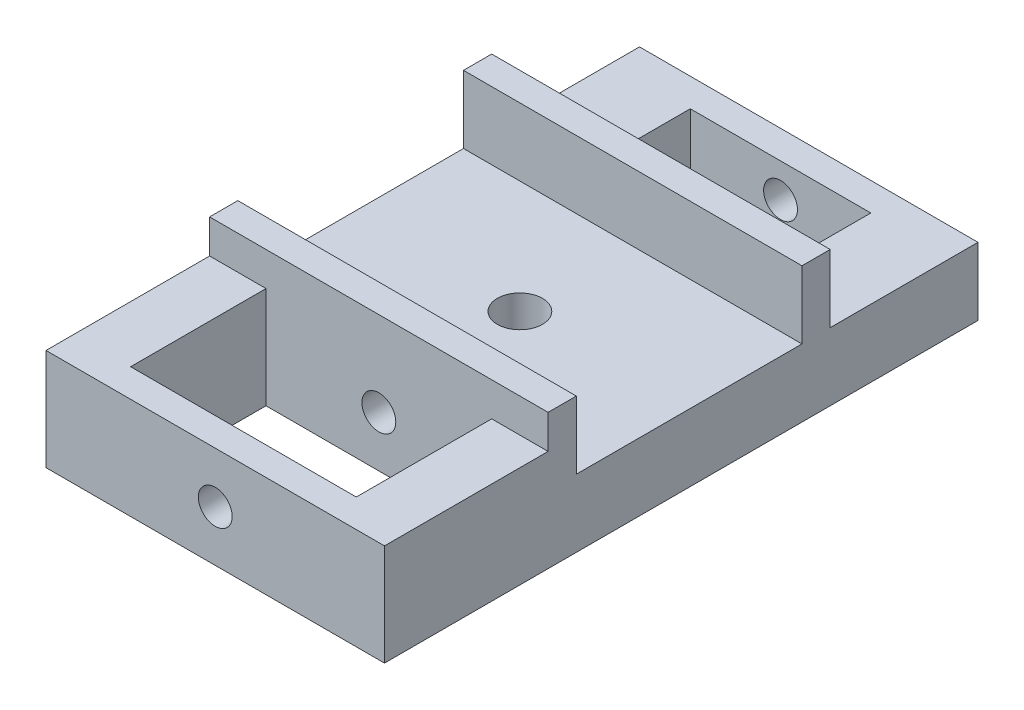
ISO-10303-21;
HEADER;
FILE_DESCRIPTION(('STEP AP214'),'2;1');
FILE_NAME('part.step','',(''),(''),'','','');
FILE_SCHEMA(('AUTOMOTIVE_DESIGN { 1 0 10303 214 1 1 1 1 }'));
ENDSEC;
DATA;
#1=APPLICATION_CONTEXT('core data for automotive mechanical design processes');
#2=APPLICATION_PROTOCOL_DEFINITION('international standard','automotive_design',2000,#1);
#3=PRODUCT_CONTEXT('',#1,'mechanical');
#4=PRODUCT('Part','Part','',(#3));
#5=PRODUCT_RELATED_PRODUCT_CATEGORY('part','',(#4));
#6=PRODUCT_DEFINITION_FORMATION('','',#4);
#7=PRODUCT_DEFINITION_CONTEXT('part definition',#1,'design');
#8=PRODUCT_DEFINITION('design','',#6,#7);
#9=PRODUCT_DEFINITION_SHAPE('','',#8);
#10=(LENGTH_UNIT() NAMED_UNIT(*) SI_UNIT(.MILLI.,.METRE.));
#11=(NAMED_UNIT(*) PLANE_ANGLE_UNIT() SI_UNIT($,.RADIAN.));
#12=(NAMED_UNIT(*) SI_UNIT($,.STERADIAN.) SOLID_ANGLE_UNIT());
#13=UNCERTAINTY_MEASURE_WITH_UNIT(LENGTH_MEASURE(1.E-05),#10,'distance_accuracy_value','');
#14=(GEOMETRIC_REPRESENTATION_CONTEXT(3) GLOBAL_UNCERTAINTY_ASSIGNED_CONTEXT((#13)) GLOBAL_UNIT_ASSIGNED_CONTEXT((#10,
#11,#12)) REPRESENTATION_CONTEXT('',''));
#15=CARTESIAN_POINT('',(0.,0.,0.));
#16=DIRECTION('',(0.,0.,1.));
#17=DIRECTION('',(1.,0.,0.));
#18=AXIS2_PLACEMENT_3D('',#15,#16,#17);
#19=CARTESIAN_POINT('',(0.,6.,0.));
#20=DIRECTION('',(0.,1.,0.));
#21=DIRECTION('',(0.,0.,1.));
#22=AXIS2_PLACEMENT_3D('',#19,#20,#21);
#23=PLANE('',#22);
#24=DIRECTION('',(-1.,0.,0.));
#25=VECTOR('',#24,1.);
#26=CARTESIAN_POINT('',(0.,6.,-2.5));
#27=LINE('',#26,#25);
#28=CARTESIAN_POINT('',(0.,6.,-2.5));
#29=VERTEX_POINT('',#28);
#30=CARTESIAN_POINT('',(-7.,6.,-2.5));
#31=VERTEX_POINT('',#30);
#32=EDGE_CURVE('E273',#29,#31,#27,.T.);
#33=ORIENTED_EDGE('',*,*,#32,.F.);
#34=DIRECTION('',(0.,0.,1.));
#35=VECTOR('',#34,1.);
#36=CARTESIAN_POINT('',(0.,6.,0.));
#37=LINE('',#36,#35);
#38=CARTESIAN_POINT('',(0.,6.,-15.6));
#39=VERTEX_POINT('',#38);
#40=EDGE_CURVE('E304',#39,#29,#37,.T.);
#41=ORIENTED_EDGE('',*,*,#40,.F.);
#42=DIRECTION('',(-1.,0.,0.));
#43=VECTOR('',#42,1.);
#44=CARTESIAN_POINT('',(0.,6.,-15.6));
#45=LINE('',#44,#43);
#46=CARTESIAN_POINT('',(-30.,6.,-15.6));
#47=VERTEX_POINT('',#46);
#48=EDGE_CURVE('E295',#39,#47,#45,.T.);
#49=ORIENTED_EDGE('',*,*,#48,.T.);
#50=DIRECTION('',(0.,0.,1.));
#51=VECTOR('',#50,1.);
#52=CARTESIAN_POINT('',(-30.,6.,0.));
#53=LINE('',#52,#51);
#54=CARTESIAN_POINT('',(-30.,6.,-2.5));
#55=VERTEX_POINT('',#54);
#56=EDGE_CURVE('E300',#47,#55,#53,.T.);
#57=ORIENTED_EDGE('',*,*,#56,.T.);
#58=CARTESIAN_POINT('',(-23.,6.,-2.5));
#59=VERTEX_POINT('',#58);
#60=EDGE_CURVE('E272',#59,#55,#27,.T.);
#61=ORIENTED_EDGE('',*,*,#60,.F.);
#62=DIRECTION('',(0.,0.,-1.));
#63=VECTOR('',#62,1.);
#64=CARTESIAN_POINT('',(-23.,6.,0.));
#65=LINE('',#64,#63);
#66=CARTESIAN_POINT('',(-23.,6.,-13.1));
#67=VERTEX_POINT('',#66);
#68=EDGE_CURVE('E307',#59,#67,#65,.T.);
#69=ORIENTED_EDGE('',*,*,#68,.T.);
#70=DIRECTION('',(1.,0.,0.));
#71=VECTOR('',#70,1.);
#72=CARTESIAN_POINT('',(0.,6.,-13.1));
#73=LINE('',#72,#71);
#74=CARTESIAN_POINT('',(-7.,6.,-13.1));
#75=VERTEX_POINT('',#74);
#76=EDGE_CURVE('E310',#67,#75,#73,.T.);
#77=ORIENTED_EDGE('',*,*,#76,.T.);
#78=DIRECTION('',(0.,0.,-1.));
#79=VECTOR('',#78,1.);
#80=CARTESIAN_POINT('',(-7.,6.,0.));
#81=LINE('',#80,#79);
#82=EDGE_CURVE('E312',#31,#75,#81,.T.);
#83=ORIENTED_EDGE('',*,*,#82,.F.);
#84=EDGE_LOOP('',(#33,#41,#49,#57,#61,#69,#77,#83));
#85=FACE_BOUND('',#84,.T.);
#86=ADVANCED_FACE('F34',(#85),#23,.T.);
#87=CARTESIAN_POINT('',(-15.,6.,10.));
#88=DIRECTION('',(0.,1.,0.));
#89=DIRECTION('',(0.,0.,1.));
#90=AXIS2_PLACEMENT_3D('',#87,#88,#89);
#91=CIRCLE('',#90,2.);
#92=CARTESIAN_POINT('',(-15.,6.,12.));
#93=VERTEX_POINT('',#92);
#94=EDGE_CURVE('E225',#93,#93,#91,.T.);
#95=ORIENTED_EDGE('',*,*,#94,.F.);
#96=EDGE_LOOP('',(#95));
#97=FACE_BOUND('',#96,.T.);
#98=DIRECTION('',(1.,0.,0.));
#99=VECTOR('',#98,1.);
#100=CARTESIAN_POINT('',(0.,6.,0.));
#101=LINE('',#100,#99);
#102=CARTESIAN_POINT('',(-30.,6.,0.));
#103=VERTEX_POINT('',#102);
#104=CARTESIAN_POINT('',(0.,6.,0.));
#105=VERTEX_POINT('',#104);
#106=EDGE_CURVE('E270',#103,#105,#101,.T.);
#107=ORIENTED_EDGE('',*,*,#106,.F.);
#108=CARTESIAN_POINT('',(-30.,6.,20.));
#109=VERTEX_POINT('',#108);
#110=EDGE_CURVE('E298',#103,#109,#53,.T.);
#111=ORIENTED_EDGE('',*,*,#110,.T.);
#112=DIRECTION('',(1.,0.,0.));
#113=VECTOR('',#112,1.);
#114=CARTESIAN_POINT('',(0.,6.,20.));
#115=LINE('',#114,#113);
#116=CARTESIAN_POINT('',(0.,6.,20.));
#117=VERTEX_POINT('',#116);
#118=EDGE_CURVE('E291',#109,#117,#115,.T.);
#119=ORIENTED_EDGE('',*,*,#118,.T.);
#120=EDGE_CURVE('E303',#105,#117,#37,.T.);
#121=ORIENTED_EDGE('',*,*,#120,.F.);
#122=EDGE_LOOP('',(#107,#111,#119,#121));
#123=FACE_BOUND('',#122,.T.);
#124=ADVANCED_FACE('F381',(#97,#123),#23,.T.);
#125=CARTESIAN_POINT('',(0.,6.,-2.5));
#126=DIRECTION('',(0.,0.,-1.));
#127=DIRECTION('',(-1.,0.,0.));
#128=AXIS2_PLACEMENT_3D('',#125,#126,#127);
#129=PLANE('',#128);
#130=CARTESIAN_POINT('',(-15.,3.,-2.5));
#131=DIRECTION('',(0.,0.,-1.));
#132=DIRECTION('',(-1.,0.,0.));
#133=AXIS2_PLACEMENT_3D('',#130,#131,#132);
#134=CIRCLE('',#133,1.5);
#135=CARTESIAN_POINT('',(-16.5,3.,-2.5));
#136=VERTEX_POINT('',#135);
#137=EDGE_CURVE('E248',#136,#136,#134,.T.);
#138=ORIENTED_EDGE('',*,*,#137,.F.);
#139=EDGE_LOOP('',(#138));
#140=FACE_BOUND('',#139,.T.);
#141=DIRECTION('',(1.,0.,0.));
#142=VECTOR('',#141,1.);
#143=CARTESIAN_POINT('',(0.,0.,-2.5));
#144=LINE('',#143,#142);
#145=CARTESIAN_POINT('',(-23.,0.,-2.5));
#146=VERTEX_POINT('',#145);
#147=CARTESIAN_POINT('',(-7.,0.,-2.5));
#148=VERTEX_POINT('',#147);
#149=EDGE_CURVE('E324',#146,#148,#144,.T.);
#150=ORIENTED_EDGE('',*,*,#149,.F.);
#151=DIRECTION('',(0.,-1.,0.));
#152=VECTOR('',#151,1.);
#153=CARTESIAN_POINT('',(-23.,6.,-2.5));
#154=LINE('',#153,#152);
#155=EDGE_CURVE('E11',#59,#146,#154,.T.);
#156=ORIENTED_EDGE('',*,*,#155,.F.);
#157=ORIENTED_EDGE('',*,*,#60,.T.);
#158=DIRECTION('',(0.,-1.,0.));
#159=VECTOR('',#158,1.);
#160=CARTESIAN_POINT('',(-30.,12.,-2.5));
#161=LINE('',#160,#159);
#162=CARTESIAN_POINT('',(-30.,12.,-2.5));
#163=VERTEX_POINT('',#162);
#164=EDGE_CURVE('E267',#163,#55,#161,.T.);
#165=ORIENTED_EDGE('',*,*,#164,.F.);
#166=DIRECTION('',(1.,0.,0.));
#167=VECTOR('',#166,1.);
#168=CARTESIAN_POINT('',(0.,12.,-2.5));
#169=LINE('',#168,#167);
#170=CARTESIAN_POINT('',(0.,12.,-2.5));
#171=VERTEX_POINT('',#170);
#172=EDGE_CURVE('E251',#163,#171,#169,.T.);
#173=ORIENTED_EDGE('',*,*,#172,.T.);
#174=DIRECTION('',(0.,-1.,0.));
#175=VECTOR('',#174,1.);
#176=CARTESIAN_POINT('',(0.,12.,-2.5));
#177=LINE('',#176,#175);
#178=EDGE_CURVE('E262',#171,#29,#177,.T.);
#179=ORIENTED_EDGE('',*,*,#178,.T.);
#180=ORIENTED_EDGE('',*,*,#32,.T.);
#181=DIRECTION('',(0.,-1.,0.));
#182=VECTOR('',#181,1.);
#183=CARTESIAN_POINT('',(-7.,6.,-2.5));
#184=LINE('',#183,#182);
#185=EDGE_CURVE('E335',#31,#148,#184,.T.);
#186=ORIENTED_EDGE('',*,*,#185,.T.);
#187=EDGE_LOOP('',(#150,#156,#157,#165,#173,#179,#180,#186));
#188=FACE_BOUND('',#187,.T.);
#189=ADVANCED_FACE('F392',(#140,#188),#129,.T.);
#190=CARTESIAN_POINT('',(-23.,6.,0.));
#191=DIRECTION('',(-1.,0.,0.));
#192=DIRECTION('',(0.,0.,1.));
#193=AXIS2_PLACEMENT_3D('',#190,#191,#192);
#194=PLANE('',#193);
#195=DIRECTION('',(0.,0.,-1.));
#196=VECTOR('',#195,1.);
#197=CARTESIAN_POINT('',(-23.,0.,0.));
#198=LINE('',#197,#196);
#199=CARTESIAN_POINT('',(-23.,0.,-13.1));
#200=VERTEX_POINT('',#199);
#201=EDGE_CURVE('E327',#146,#200,#198,.T.);
#202=ORIENTED_EDGE('',*,*,#201,.T.);
#203=DIRECTION('',(0.,-1.,0.));
#204=VECTOR('',#203,1.);
#205=CARTESIAN_POINT('',(-23.,6.,-13.1));
#206=LINE('',#205,#204);
#207=EDGE_CURVE('E43',#67,#200,#206,.T.);
#208=ORIENTED_EDGE('',*,*,#207,.F.);
#209=ORIENTED_EDGE('',*,*,#68,.F.);
#210=ORIENTED_EDGE('',*,*,#155,.T.);
#211=EDGE_LOOP('',(#202,#208,#209,#210));
#212=FACE_BOUND('',#211,.T.);
#213=ADVANCED_FACE('F408',(#212),#194,.F.);
#214=CARTESIAN_POINT('',(0.,6.,-13.1));
#215=DIRECTION('',(0.,0.,-1.));
#216=DIRECTION('',(-1.,0.,0.));
#217=AXIS2_PLACEMENT_3D('',#214,#215,#216);
#218=PLANE('',#217);
#219=CARTESIAN_POINT('',(-15.,3.,-13.1));
#220=DIRECTION('',(0.,0.,-1.));
#221=DIRECTION('',(-1.,0.,0.));
#222=AXIS2_PLACEMENT_3D('',#219,#220,#221);
#223=CIRCLE('',#222,1.5);
#224=CARTESIAN_POINT('',(-16.5,3.,-13.1));
#225=VERTEX_POINT('',#224);
#226=EDGE_CURVE('E243',#225,#225,#223,.T.);
#227=ORIENTED_EDGE('',*,*,#226,.T.);
#228=EDGE_LOOP('',(#227));
#229=FACE_BOUND('',#228,.T.);
#230=DIRECTION('',(1.,0.,0.));
#231=VECTOR('',#230,1.);
#232=CARTESIAN_POINT('',(0.,0.,-13.1));
#233=LINE('',#232,#231);
#234=CARTESIAN_POINT('',(-7.,0.,-13.1));
#235=VERTEX_POINT('',#234);
#236=EDGE_CURVE('E330',#200,#235,#233,.T.);
#237=ORIENTED_EDGE('',*,*,#236,.T.);
#238=DIRECTION('',(0.,-1.,0.));
#239=VECTOR('',#238,1.);
#240=CARTESIAN_POINT('',(-7.,6.,-13.1));
#241=LINE('',#240,#239);
#242=EDGE_CURVE('E337',#75,#235,#241,.T.);
#243=ORIENTED_EDGE('',*,*,#242,.F.);
#244=ORIENTED_EDGE('',*,*,#76,.F.);
#245=ORIENTED_EDGE('',*,*,#207,.T.);
#246=EDGE_LOOP('',(#237,#243,#244,#245));
#247=FACE_BOUND('',#246,.T.);
#248=ADVANCED_FACE('F410',(#229,#247),#218,.F.);
#249=CARTESIAN_POINT('',(0.,6.,-15.6));
#250=DIRECTION('',(0.,0.,1.));
#251=DIRECTION('',(1.,0.,0.));
#252=AXIS2_PLACEMENT_3D('',#249,#250,#251);
#253=PLANE('',#252);
#254=CARTESIAN_POINT('',(-15.,3.,-15.6));
#255=DIRECTION('',(0.,0.,-1.));
#256=DIRECTION('',(-1.,0.,0.));
#257=AXIS2_PLACEMENT_3D('',#254,#255,#256);
#258=CIRCLE('',#257,1.5);
#259=CARTESIAN_POINT('',(-16.5,3.,-15.6));
#260=VERTEX_POINT('',#259);
#261=EDGE_CURVE('E237',#260,#260,#258,.T.);
#262=ORIENTED_EDGE('',*,*,#261,.F.);
#263=EDGE_LOOP('',(#262));
#264=FACE_BOUND('',#263,.T.);
#265=DIRECTION('',(-1.,0.,0.));
#266=VECTOR('',#265,1.);
#267=CARTESIAN_POINT('',(0.,0.,-15.6));
#268=LINE('',#267,#266);
#269=CARTESIAN_POINT('',(0.,0.,-15.6));
#270=VERTEX_POINT('',#269);
#271=CARTESIAN_POINT('',(-30.,0.,-15.6));
#272=VERTEX_POINT('',#271);
#273=EDGE_CURVE('E294',#270,#272,#268,.T.);
#274=ORIENTED_EDGE('',*,*,#273,.T.);
#275=DIRECTION('',(0.,-1.,0.));
#276=VECTOR('',#275,1.);
#277=CARTESIAN_POINT('',(-30.,6.,-15.6));
#278=LINE('',#277,#276);
#279=EDGE_CURVE('E338',#47,#272,#278,.T.);
#280=ORIENTED_EDGE('',*,*,#279,.F.);
#281=ORIENTED_EDGE('',*,*,#48,.F.);
#282=DIRECTION('',(0.,-1.,0.));
#283=VECTOR('',#282,1.);
#284=CARTESIAN_POINT('',(0.,6.,-15.6));
#285=LINE('',#284,#283);
#286=EDGE_CURVE('E315',#39,#270,#285,.T.);
#287=ORIENTED_EDGE('',*,*,#286,.T.);
#288=EDGE_LOOP('',(#274,#280,#281,#287));
#289=FACE_BOUND('',#288,.T.);
#290=ADVANCED_FACE('F36',(#264,#289),#253,.F.);
#291=CARTESIAN_POINT('',(-30.,6.,0.));
#292=DIRECTION('',(1.,0.,0.));
#293=DIRECTION('',(0.,0.,-1.));
#294=AXIS2_PLACEMENT_3D('',#291,#292,#293);
#295=PLANE('',#294);
#296=ORIENTED_EDGE('',*,*,#110,.F.);
#297=DIRECTION('',(0.,-1.,0.));
#298=VECTOR('',#297,1.);
#299=CARTESIAN_POINT('',(-30.,12.,0.));
#300=LINE('',#299,#298);
#301=CARTESIAN_POINT('',(-30.,12.,0.));
#302=VERTEX_POINT('',#301);
#303=EDGE_CURVE('E265',#302,#103,#300,.T.);
#304=ORIENTED_EDGE('',*,*,#303,.F.);
#305=DIRECTION('',(0.,0.,-1.));
#306=VECTOR('',#305,1.);
#307=CARTESIAN_POINT('',(-30.,12.,0.));
#308=LINE('',#307,#306);
#309=EDGE_CURVE('E254',#302,#163,#308,.T.);
#310=ORIENTED_EDGE('',*,*,#309,.T.);
#311=ORIENTED_EDGE('',*,*,#164,.T.);
#312=ORIENTED_EDGE('',*,*,#56,.F.);
#313=ORIENTED_EDGE('',*,*,#279,.T.);
#314=DIRECTION('',(0.,0.,1.));
#315=VECTOR('',#314,1.);
#316=CARTESIAN_POINT('',(-30.,0.,0.));
#317=LINE('',#316,#315);
#318=CARTESIAN_POINT('',(-30.,0.,37.));
#319=VERTEX_POINT('',#318);
#320=EDGE_CURVE('E318',#272,#319,#317,.T.);
#321=ORIENTED_EDGE('',*,*,#320,.T.);
#322=DIRECTION('',(0.,-1.,0.));
#323=VECTOR('',#322,1.);
#324=CARTESIAN_POINT('',(-30.,9.,37.));
#325=LINE('',#324,#323);
#326=CARTESIAN_POINT('',(-30.,9.,37.));
#327=VERTEX_POINT('',#326);
#328=EDGE_CURVE('E222',#327,#319,#325,.T.);
#329=ORIENTED_EDGE('',*,*,#328,.F.);
#330=DIRECTION('',(0.,0.,1.));
#331=VECTOR('',#330,1.);
#332=CARTESIAN_POINT('',(-30.,9.,0.));
#333=LINE('',#332,#331);
#334=CARTESIAN_POINT('',(-30.,9.,22.5));
#335=VERTEX_POINT('',#334);
#336=EDGE_CURVE('E184',#335,#327,#333,.T.);
#337=ORIENTED_EDGE('',*,*,#336,.F.);
#338=DIRECTION('',(0.,-1.,0.));
#339=VECTOR('',#338,1.);
#340=CARTESIAN_POINT('',(-30.,6.,22.5));
#341=LINE('',#340,#339);
#342=CARTESIAN_POINT('',(-30.,12.,22.5));
#343=VERTEX_POINT('',#342);
#344=EDGE_CURVE('E198',#343,#335,#341,.T.);
#345=ORIENTED_EDGE('',*,*,#344,.F.);
#346=DIRECTION('',(0.,0.,-1.));
#347=VECTOR('',#346,1.);
#348=CARTESIAN_POINT('',(-30.,12.,0.));
#349=LINE('',#348,#347);
#350=CARTESIAN_POINT('',(-30.,12.,20.));
#351=VERTEX_POINT('',#350);
#352=EDGE_CURVE('E275',#343,#351,#349,.T.);
#353=ORIENTED_EDGE('',*,*,#352,.T.);
#354=DIRECTION('',(0.,-1.,0.));
#355=VECTOR('',#354,1.);
#356=CARTESIAN_POINT('',(-30.,12.,20.));
#357=LINE('',#356,#355);
#358=EDGE_CURVE('E285',#351,#109,#357,.T.);
#359=ORIENTED_EDGE('',*,*,#358,.T.);
#360=EDGE_LOOP('',(#296,#304,#310,#311,#312,#313,#321,#329,#337,#345,#353,#359));
#361=FACE_BOUND('',#360,.T.);
#362=ADVANCED_FACE('F350',(#361),#295,.F.);
#363=CARTESIAN_POINT('',(0.,6.,22.5));
#364=DIRECTION('',(0.,0.,1.));
#365=DIRECTION('',(1.,0.,0.));
#366=AXIS2_PLACEMENT_3D('',#363,#364,#365);
#367=PLANE('',#366);
#368=CARTESIAN_POINT('',(-15.,4.5,22.5));
#369=DIRECTION('',(0.,0.,1.));
#370=DIRECTION('',(1.,0.,0.));
#371=AXIS2_PLACEMENT_3D('',#368,#369,#370);
#372=CIRCLE('',#371,1.5);
#373=CARTESIAN_POINT('',(-13.5,4.5,22.5));
#374=VERTEX_POINT('',#373);
#375=EDGE_CURVE('E204',#374,#374,#372,.T.);
#376=ORIENTED_EDGE('',*,*,#375,.F.);
#377=EDGE_LOOP('',(#376));
#378=FACE_BOUND('',#377,.T.);
#379=DIRECTION('',(0.,-1.,0.));
#380=VECTOR('',#379,1.);
#381=CARTESIAN_POINT('',(-25.,9.,22.5));
#382=LINE('',#381,#380);
#383=CARTESIAN_POINT('',(-25.,9.,22.5));
#384=VERTEX_POINT('',#383);
#385=CARTESIAN_POINT('',(-25.,0.,22.5));
#386=VERTEX_POINT('',#385);
#387=EDGE_CURVE('E174',#384,#386,#382,.T.);
#388=ORIENTED_EDGE('',*,*,#387,.T.);
#389=DIRECTION('',(-1.,0.,0.));
#390=VECTOR('',#389,1.);
#391=CARTESIAN_POINT('',(0.,0.,22.5));
#392=LINE('',#391,#390);
#393=CARTESIAN_POINT('',(-5.,0.,22.5));
#394=VERTEX_POINT('',#393);
#395=EDGE_CURVE('E320',#394,#386,#392,.T.);
#396=ORIENTED_EDGE('',*,*,#395,.F.);
#397=DIRECTION('',(0.,-1.,0.));
#398=VECTOR('',#397,1.);
#399=CARTESIAN_POINT('',(-5.,9.,22.5));
#400=LINE('',#399,#398);
#401=CARTESIAN_POINT('',(-5.,9.,22.5));
#402=VERTEX_POINT('',#401);
#403=EDGE_CURVE('E229',#402,#394,#400,.T.);
#404=ORIENTED_EDGE('',*,*,#403,.F.);
#405=DIRECTION('',(-1.,0.,0.));
#406=VECTOR('',#405,1.);
#407=CARTESIAN_POINT('',(0.,9.,22.5));
#408=LINE('',#407,#406);
#409=CARTESIAN_POINT('',(0.,9.,22.5));
#410=VERTEX_POINT('',#409);
#411=EDGE_CURVE('E211',#410,#402,#408,.T.);
#412=ORIENTED_EDGE('',*,*,#411,.F.);
#413=DIRECTION('',(0.,-1.,0.));
#414=VECTOR('',#413,1.);
#415=CARTESIAN_POINT('',(0.,6.,22.5));
#416=LINE('',#415,#414);
#417=CARTESIAN_POINT('',(0.,12.,22.5));
#418=VERTEX_POINT('',#417);
#419=EDGE_CURVE('E343',#418,#410,#416,.T.);
#420=ORIENTED_EDGE('',*,*,#419,.F.);
#421=DIRECTION('',(-1.,0.,0.));
#422=VECTOR('',#421,1.);
#423=CARTESIAN_POINT('',(0.,12.,22.5));
#424=LINE('',#423,#422);
#425=EDGE_CURVE('E278',#418,#343,#424,.T.);
#426=ORIENTED_EDGE('',*,*,#425,.T.);
#427=ORIENTED_EDGE('',*,*,#344,.T.);
#428=DIRECTION('',(-1.,0.,0.));
#429=VECTOR('',#428,1.);
#430=CARTESIAN_POINT('',(0.,9.,22.5));
#431=LINE('',#430,#429);
#432=EDGE_CURVE('E190',#384,#335,#431,.T.);
#433=ORIENTED_EDGE('',*,*,#432,.F.);
#434=EDGE_LOOP('',(#388,#396,#404,#412,#420,#426,#427,#433));
#435=FACE_BOUND('',#434,.T.);
#436=ADVANCED_FACE('F196',(#378,#435),#367,.T.);
#437=CARTESIAN_POINT('',(0.,6.,0.));
#438=DIRECTION('',(1.,0.,0.));
#439=DIRECTION('',(0.,0.,-1.));
#440=AXIS2_PLACEMENT_3D('',#437,#438,#439);
#441=PLANE('',#440);
#442=ORIENTED_EDGE('',*,*,#419,.T.);
#443=DIRECTION('',(0.,0.,-1.));
#444=VECTOR('',#443,1.);
#445=CARTESIAN_POINT('',(0.,9.,0.));
#446=LINE('',#445,#444);
#447=CARTESIAN_POINT('',(0.,9.,37.));
#448=VERTEX_POINT('',#447);
#449=EDGE_CURVE('E213',#448,#410,#446,.T.);
#450=ORIENTED_EDGE('',*,*,#449,.F.);
#451=DIRECTION('',(0.,-1.,0.));
#452=VECTOR('',#451,1.);
#453=CARTESIAN_POINT('',(0.,9.,37.));
#454=LINE('',#453,#452);
#455=CARTESIAN_POINT('',(0.,0.,37.));
#456=VERTEX_POINT('',#455);
#457=EDGE_CURVE('E226',#448,#456,#454,.T.);
#458=ORIENTED_EDGE('',*,*,#457,.T.);
#459=DIRECTION('',(0.,0.,1.));
#460=VECTOR('',#459,1.);
#461=CARTESIAN_POINT('',(0.,0.,0.));
#462=LINE('',#461,#460);
#463=EDGE_CURVE('E322',#270,#456,#462,.T.);
#464=ORIENTED_EDGE('',*,*,#463,.F.);
#465=ORIENTED_EDGE('',*,*,#286,.F.);
#466=ORIENTED_EDGE('',*,*,#40,.T.);
#467=ORIENTED_EDGE('',*,*,#178,.F.);
#468=DIRECTION('',(0.,0.,-1.));
#469=VECTOR('',#468,1.);
#470=CARTESIAN_POINT('',(0.,12.,0.));
#471=LINE('',#470,#469);
#472=CARTESIAN_POINT('',(0.,12.,0.));
#473=VERTEX_POINT('',#472);
#474=EDGE_CURVE('E260',#473,#171,#471,.T.);
#475=ORIENTED_EDGE('',*,*,#474,.F.);
#476=DIRECTION('',(0.,-1.,0.));
#477=VECTOR('',#476,1.);
#478=CARTESIAN_POINT('',(0.,12.,0.));
#479=LINE('',#478,#477);
#480=EDGE_CURVE('E59',#473,#105,#479,.T.);
#481=ORIENTED_EDGE('',*,*,#480,.T.);
#482=ORIENTED_EDGE('',*,*,#120,.T.);
#483=DIRECTION('',(0.,-1.,0.));
#484=VECTOR('',#483,1.);
#485=CARTESIAN_POINT('',(0.,12.,20.));
#486=LINE('',#485,#484);
#487=CARTESIAN_POINT('',(0.,12.,20.));
#488=VERTEX_POINT('',#487);
#489=EDGE_CURVE('E288',#488,#117,#486,.T.);
#490=ORIENTED_EDGE('',*,*,#489,.F.);
#491=DIRECTION('',(0.,0.,1.));
#492=VECTOR('',#491,1.);
#493=CARTESIAN_POINT('',(0.,12.,0.));
#494=LINE('',#493,#492);
#495=EDGE_CURVE('E280',#488,#418,#494,.T.);
#496=ORIENTED_EDGE('',*,*,#495,.T.);
#497=EDGE_LOOP('',(#442,#450,#458,#464,#465,#466,#467,#475,#481,#482,#490,#496));
#498=FACE_BOUND('',#497,.T.);
#499=ADVANCED_FACE('F360',(#498),#441,.T.);
#500=CARTESIAN_POINT('',(-7.,6.,0.));
#501=DIRECTION('',(-1.,0.,0.));
#502=DIRECTION('',(0.,0.,1.));
#503=AXIS2_PLACEMENT_3D('',#500,#501,#502);
#504=PLANE('',#503);
#505=DIRECTION('',(0.,0.,-1.));
#506=VECTOR('',#505,1.);
#507=CARTESIAN_POINT('',(-7.,0.,0.));
#508=LINE('',#507,#506);
#509=EDGE_CURVE('E299',#148,#235,#508,.T.);
#510=ORIENTED_EDGE('',*,*,#509,.F.);
#511=ORIENTED_EDGE('',*,*,#185,.F.);
#512=ORIENTED_EDGE('',*,*,#82,.T.);
#513=ORIENTED_EDGE('',*,*,#242,.T.);
#514=EDGE_LOOP('',(#510,#511,#512,#513));
#515=FACE_BOUND('',#514,.T.);
#516=ADVANCED_FACE('F401',(#515),#504,.T.);
#517=CARTESIAN_POINT('',(0.,0.,0.));
#518=DIRECTION('',(0.,1.,0.));
#519=DIRECTION('',(0.,0.,1.));
#520=AXIS2_PLACEMENT_3D('',#517,#518,#519);
#521=PLANE('',#520);
#522=DIRECTION('',(1.,0.,0.));
#523=VECTOR('',#522,1.);
#524=CARTESIAN_POINT('',(0.,0.,37.));
#525=LINE('',#524,#523);
#526=EDGE_CURVE('E199',#319,#456,#525,.T.);
#527=ORIENTED_EDGE('',*,*,#526,.F.);
#528=ORIENTED_EDGE('',*,*,#320,.F.);
#529=ORIENTED_EDGE('',*,*,#273,.F.);
#530=ORIENTED_EDGE('',*,*,#463,.T.);
#531=EDGE_LOOP('',(#527,#528,#529,#530));
#532=FACE_BOUND('',#531,.T.);
#533=CARTESIAN_POINT('',(-15.,0.,10.));
#534=DIRECTION('',(0.,1.,0.));
#535=DIRECTION('',(0.,0.,1.));
#536=AXIS2_PLACEMENT_3D('',#533,#534,#535);
#537=CIRCLE('',#536,2.);
#538=CARTESIAN_POINT('',(-15.,0.,12.));
#539=VERTEX_POINT('',#538);
#540=EDGE_CURVE('E234',#539,#539,#537,.T.);
#541=ORIENTED_EDGE('',*,*,#540,.T.);
#542=EDGE_LOOP('',(#541));
#543=FACE_BOUND('',#542,.T.);
#544=ORIENTED_EDGE('',*,*,#149,.T.);
#545=ORIENTED_EDGE('',*,*,#509,.T.);
#546=ORIENTED_EDGE('',*,*,#236,.F.);
#547=ORIENTED_EDGE('',*,*,#201,.F.);
#548=EDGE_LOOP('',(#544,#545,#546,#547));
#549=FACE_BOUND('',#548,.T.);
#550=ORIENTED_EDGE('',*,*,#395,.T.);
#551=DIRECTION('',(0.,0.,1.));
#552=VECTOR('',#551,1.);
#553=CARTESIAN_POINT('',(-25.,0.,0.));
#554=LINE('',#553,#552);
#555=CARTESIAN_POINT('',(-25.,0.,34.5));
#556=VERTEX_POINT('',#555);
#557=EDGE_CURVE('E179',#386,#556,#554,.T.);
#558=ORIENTED_EDGE('',*,*,#557,.T.);
#559=DIRECTION('',(1.,0.,0.));
#560=VECTOR('',#559,1.);
#561=CARTESIAN_POINT('',(0.,0.,34.5));
#562=LINE('',#561,#560);
#563=CARTESIAN_POINT('',(-5.,0.,34.5));
#564=VERTEX_POINT('',#563);
#565=EDGE_CURVE('E219',#556,#564,#562,.T.);
#566=ORIENTED_EDGE('',*,*,#565,.T.);
#567=DIRECTION('',(0.,0.,-1.));
#568=VECTOR('',#567,1.);
#569=CARTESIAN_POINT('',(-5.,0.,0.));
#570=LINE('',#569,#568);
#571=EDGE_CURVE('E51',#564,#394,#570,.T.);
#572=ORIENTED_EDGE('',*,*,#571,.T.);
#573=EDGE_LOOP('',(#550,#558,#566,#572));
#574=FACE_BOUND('',#573,.T.);
#575=ADVANCED_FACE('F358',(#532,#543,#549,#574),#521,.F.);
#576=CARTESIAN_POINT('',(0.,12.,20.));
#577=DIRECTION('',(0.,0.,1.));
#578=DIRECTION('',(1.,0.,0.));
#579=AXIS2_PLACEMENT_3D('',#576,#577,#578);
#580=PLANE('',#579);
#581=ORIENTED_EDGE('',*,*,#118,.F.);
#582=ORIENTED_EDGE('',*,*,#358,.F.);
#583=DIRECTION('',(-1.,0.,0.));
#584=VECTOR('',#583,1.);
#585=CARTESIAN_POINT('',(0.,12.,20.));
#586=LINE('',#585,#584);
#587=EDGE_CURVE('E283',#488,#351,#586,.T.);
#588=ORIENTED_EDGE('',*,*,#587,.F.);
#589=ORIENTED_EDGE('',*,*,#489,.T.);
#590=EDGE_LOOP('',(#581,#582,#588,#589));
#591=FACE_BOUND('',#590,.T.);
#592=ADVANCED_FACE('F377',(#591),#580,.F.);
#593=CARTESIAN_POINT('',(0.,12.,0.));
#594=DIRECTION('',(0.,1.,0.));
#595=DIRECTION('',(0.,0.,1.));
#596=AXIS2_PLACEMENT_3D('',#593,#594,#595);
#597=PLANE('',#596);
#598=ORIENTED_EDGE('',*,*,#352,.F.);
#599=ORIENTED_EDGE('',*,*,#425,.F.);
#600=ORIENTED_EDGE('',*,*,#495,.F.);
#601=ORIENTED_EDGE('',*,*,#587,.T.);
#602=EDGE_LOOP('',(#598,#599,#600,#601));
#603=FACE_BOUND('',#602,.T.);
#604=ADVANCED_FACE('F373',(#603),#597,.T.);
#605=CARTESIAN_POINT('',(0.,12.,0.));
#606=DIRECTION('',(0.,0.,1.));
#607=DIRECTION('',(1.,0.,0.));
#608=AXIS2_PLACEMENT_3D('',#605,#606,#607);
#609=PLANE('',#608);
#610=ORIENTED_EDGE('',*,*,#303,.T.);
#611=ORIENTED_EDGE('',*,*,#106,.T.);
#612=ORIENTED_EDGE('',*,*,#480,.F.);
#613=DIRECTION('',(-1.,0.,0.));
#614=VECTOR('',#613,1.);
#615=CARTESIAN_POINT('',(0.,12.,0.));
#616=LINE('',#615,#614);
#617=EDGE_CURVE('E257',#473,#302,#616,.T.);
#618=ORIENTED_EDGE('',*,*,#617,.T.);
#619=EDGE_LOOP('',(#610,#611,#612,#618));
#620=FACE_BOUND('',#619,.T.);
#621=ADVANCED_FACE('F383',(#620),#609,.T.);
#622=CARTESIAN_POINT('',(0.,12.,0.));
#623=DIRECTION('',(0.,1.,0.));
#624=DIRECTION('',(0.,0.,1.));
#625=AXIS2_PLACEMENT_3D('',#622,#623,#624);
#626=PLANE('',#625);
#627=ORIENTED_EDGE('',*,*,#172,.F.);
#628=ORIENTED_EDGE('',*,*,#309,.F.);
#629=ORIENTED_EDGE('',*,*,#617,.F.);
#630=ORIENTED_EDGE('',*,*,#474,.T.);
#631=EDGE_LOOP('',(#627,#628,#629,#630));
#632=FACE_BOUND('',#631,.T.);
#633=ADVANCED_FACE('F388',(#632),#626,.T.);
#634=CARTESIAN_POINT('',(-15.,3.,0.399999999999998));
#635=DIRECTION('',(0.,0.,-1.));
#636=DIRECTION('',(-1.,0.,0.));
#637=AXIS2_PLACEMENT_3D('',#634,#635,#636);
#638=CYLINDRICAL_SURFACE('',#637,1.5);
#639=ORIENTED_EDGE('',*,*,#261,.T.);
#640=EDGE_LOOP('',(#639));
#641=FACE_BOUND('',#640,.T.);
#642=ORIENTED_EDGE('',*,*,#226,.F.);
#643=EDGE_LOOP('',(#642));
#644=FACE_BOUND('',#643,.T.);
#645=ADVANCED_FACE('F536',(#641,#644),#638,.F.);
#646=ORIENTED_EDGE('',*,*,#137,.T.);
#647=EDGE_LOOP('',(#646));
#648=FACE_BOUND('',#647,.T.);
#649=CARTESIAN_POINT('',(-15.,3.,0.399999999999998));
#650=DIRECTION('',(0.,0.,-1.));
#651=DIRECTION('',(-1.,0.,0.));
#652=AXIS2_PLACEMENT_3D('',#649,#650,#651);
#653=CIRCLE('',#652,1.5);
#654=CARTESIAN_POINT('',(-16.5,3.,0.399999999999998));
#655=VERTEX_POINT('',#654);
#656=EDGE_CURVE('E240',#655,#655,#653,.T.);
#657=ORIENTED_EDGE('',*,*,#656,.F.);
#658=EDGE_LOOP('',(#657));
#659=FACE_BOUND('',#658,.T.);
#660=ADVANCED_FACE('F532',(#648,#659),#638,.F.);
#661=CARTESIAN_POINT('',(-15.,3.,0.399999999999998));
#662=DIRECTION('',(0.,0.,-1.));
#663=DIRECTION('',(-1.,0.,0.));
#664=AXIS2_PLACEMENT_3D('',#661,#662,#663);
#665=PLANE('',#664);
#666=ORIENTED_EDGE('',*,*,#656,.T.);
#667=EDGE_LOOP('',(#666));
#668=FACE_BOUND('',#667,.T.);
#669=ADVANCED_FACE('F528',(#668),#665,.T.);
#670=CARTESIAN_POINT('',(-15.,0.,10.));
#671=DIRECTION('',(0.,1.,0.));
#672=DIRECTION('',(0.,0.,1.));
#673=AXIS2_PLACEMENT_3D('',#670,#671,#672);
#674=CYLINDRICAL_SURFACE('',#673,2.);
#675=ORIENTED_EDGE('',*,*,#540,.F.);
#676=EDGE_LOOP('',(#675));
#677=FACE_BOUND('',#676,.T.);
#678=ORIENTED_EDGE('',*,*,#94,.T.);
#679=EDGE_LOOP('',(#678));
#680=FACE_BOUND('',#679,.T.);
#681=ADVANCED_FACE('F470',(#677,#680),#674,.F.);
#682=CARTESIAN_POINT('',(0.,9.,37.));
#683=DIRECTION('',(0.,0.,-1.));
#684=DIRECTION('',(-1.,0.,0.));
#685=AXIS2_PLACEMENT_3D('',#682,#683,#684);
#686=PLANE('',#685);
#687=CARTESIAN_POINT('',(-15.,4.5,37.));
#688=DIRECTION('',(0.,0.,1.));
#689=DIRECTION('',(1.,0.,0.));
#690=AXIS2_PLACEMENT_3D('',#687,#688,#689);
#691=CIRCLE('',#690,1.5);
#692=CARTESIAN_POINT('',(-13.5,4.5,37.));
#693=VERTEX_POINT('',#692);
#694=EDGE_CURVE('E829',#693,#693,#691,.T.);
#695=ORIENTED_EDGE('',*,*,#694,.F.);
#696=EDGE_LOOP('',(#695));
#697=FACE_BOUND('',#696,.T.);
#698=ORIENTED_EDGE('',*,*,#526,.T.);
#699=ORIENTED_EDGE('',*,*,#457,.F.);
#700=DIRECTION('',(1.,0.,0.));
#701=VECTOR('',#700,1.);
#702=CARTESIAN_POINT('',(0.,9.,37.));
#703=LINE('',#702,#701);
#704=EDGE_CURVE('E215',#327,#448,#703,.T.);
#705=ORIENTED_EDGE('',*,*,#704,.F.);
#706=ORIENTED_EDGE('',*,*,#328,.T.);
#707=EDGE_LOOP('',(#698,#699,#705,#706));
#708=FACE_BOUND('',#707,.T.);
#709=ADVANCED_FACE('F365',(#697,#708),#686,.F.);
#710=CARTESIAN_POINT('',(-5.,9.,0.));
#711=DIRECTION('',(-1.,0.,0.));
#712=DIRECTION('',(0.,0.,1.));
#713=AXIS2_PLACEMENT_3D('',#710,#711,#712);
#714=PLANE('',#713);
#715=ORIENTED_EDGE('',*,*,#571,.F.);
#716=DIRECTION('',(0.,-1.,0.));
#717=VECTOR('',#716,1.);
#718=CARTESIAN_POINT('',(-5.,9.,34.5));
#719=LINE('',#718,#717);
#720=CARTESIAN_POINT('',(-5.,9.,34.5));
#721=VERTEX_POINT('',#720);
#722=EDGE_CURVE('E231',#721,#564,#719,.T.);
#723=ORIENTED_EDGE('',*,*,#722,.F.);
#724=DIRECTION('',(0.,0.,-1.));
#725=VECTOR('',#724,1.);
#726=CARTESIAN_POINT('',(-5.,9.,0.));
#727=LINE('',#726,#725);
#728=EDGE_CURVE('E208',#721,#402,#727,.T.);
#729=ORIENTED_EDGE('',*,*,#728,.T.);
#730=ORIENTED_EDGE('',*,*,#403,.T.);
#731=EDGE_LOOP('',(#715,#723,#729,#730));
#732=FACE_BOUND('',#731,.T.);
#733=ADVANCED_FACE('F469',(#732),#714,.T.);
#734=CARTESIAN_POINT('',(0.,9.,34.5));
#735=DIRECTION('',(0.,0.,-1.));
#736=DIRECTION('',(-1.,0.,0.));
#737=AXIS2_PLACEMENT_3D('',#734,#735,#736);
#738=PLANE('',#737);
#739=CARTESIAN_POINT('',(-15.,4.5,34.5));
#740=DIRECTION('',(0.,0.,-1.));
#741=DIRECTION('',(-1.,0.,0.));
#742=AXIS2_PLACEMENT_3D('',#739,#740,#741);
#743=CIRCLE('',#742,1.5);
#744=CARTESIAN_POINT('',(-16.5,4.5,34.5));
#745=VERTEX_POINT('',#744);
#746=EDGE_CURVE('E38',#745,#745,#743,.T.);
#747=ORIENTED_EDGE('',*,*,#746,.F.);
#748=EDGE_LOOP('',(#747));
#749=FACE_BOUND('',#748,.T.);
#750=ORIENTED_EDGE('',*,*,#565,.F.);
#751=DIRECTION('',(0.,-1.,0.));
#752=VECTOR('',#751,1.);
#753=CARTESIAN_POINT('',(-25.,9.,34.5));
#754=LINE('',#753,#752);
#755=CARTESIAN_POINT('',(-25.,9.,34.5));
#756=VERTEX_POINT('',#755);
#757=EDGE_CURVE('E183',#756,#556,#754,.T.);
#758=ORIENTED_EDGE('',*,*,#757,.F.);
#759=DIRECTION('',(1.,0.,0.));
#760=VECTOR('',#759,1.);
#761=CARTESIAN_POINT('',(0.,9.,34.5));
#762=LINE('',#761,#760);
#763=EDGE_CURVE('E194',#756,#721,#762,.T.);
#764=ORIENTED_EDGE('',*,*,#763,.T.);
#765=ORIENTED_EDGE('',*,*,#722,.T.);
#766=EDGE_LOOP('',(#750,#758,#764,#765));
#767=FACE_BOUND('',#766,.T.);
#768=ADVANCED_FACE('F480',(#749,#767),#738,.T.);
#769=CARTESIAN_POINT('',(-25.,9.,0.));
#770=DIRECTION('',(1.,0.,0.));
#771=DIRECTION('',(0.,0.,-1.));
#772=AXIS2_PLACEMENT_3D('',#769,#770,#771);
#773=PLANE('',#772);
#774=ORIENTED_EDGE('',*,*,#557,.F.);
#775=ORIENTED_EDGE('',*,*,#387,.F.);
#776=DIRECTION('',(0.,0.,1.));
#777=VECTOR('',#776,1.);
#778=CARTESIAN_POINT('',(-25.,9.,0.));
#779=LINE('',#778,#777);
#780=EDGE_CURVE('E177',#384,#756,#779,.T.);
#781=ORIENTED_EDGE('',*,*,#780,.T.);
#782=ORIENTED_EDGE('',*,*,#757,.T.);
#783=EDGE_LOOP('',(#774,#775,#781,#782));
#784=FACE_BOUND('',#783,.T.);
#785=ADVANCED_FACE('F176',(#784),#773,.T.);
#786=CARTESIAN_POINT('',(0.,9.,0.));
#787=DIRECTION('',(0.,-1.,0.));
#788=DIRECTION('',(0.,0.,-1.));
#789=AXIS2_PLACEMENT_3D('',#786,#787,#788);
#790=PLANE('',#789);
#791=ORIENTED_EDGE('',*,*,#432,.T.);
#792=ORIENTED_EDGE('',*,*,#336,.T.);
#793=ORIENTED_EDGE('',*,*,#704,.T.);
#794=ORIENTED_EDGE('',*,*,#449,.T.);
#795=ORIENTED_EDGE('',*,*,#411,.T.);
#796=ORIENTED_EDGE('',*,*,#728,.F.);
#797=ORIENTED_EDGE('',*,*,#763,.F.);
#798=ORIENTED_EDGE('',*,*,#780,.F.);
#799=EDGE_LOOP('',(#791,#792,#793,#794,#795,#796,#797,#798));
#800=FACE_BOUND('',#799,.T.);
#801=ADVANCED_FACE('F189',(#800),#790,.F.);
#802=CARTESIAN_POINT('',(-15.,4.5,20.01));
#803=DIRECTION('',(0.,0.,1.));
#804=DIRECTION('',(1.,0.,0.));
#805=AXIS2_PLACEMENT_3D('',#802,#803,#804);
#806=CYLINDRICAL_SURFACE('',#805,1.5);
#807=ORIENTED_EDGE('',*,*,#746,.T.);
#808=EDGE_LOOP('',(#807));
#809=FACE_BOUND('',#808,.T.);
#810=ORIENTED_EDGE('',*,*,#694,.T.);
#811=EDGE_LOOP('',(#810));
#812=FACE_BOUND('',#811,.T.);
#813=ADVANCED_FACE('F493',(#809,#812),#806,.F.);
#814=ORIENTED_EDGE('',*,*,#375,.T.);
#815=EDGE_LOOP('',(#814));
#816=FACE_BOUND('',#815,.T.);
#817=CARTESIAN_POINT('',(-15.,4.5,20.01));
#818=DIRECTION('',(0.,0.,1.));
#819=DIRECTION('',(1.,0.,0.));
#820=AXIS2_PLACEMENT_3D('',#817,#818,#819);
#821=CIRCLE('',#820,1.5);
#822=CARTESIAN_POINT('',(-13.5,4.5,20.01));
#823=VERTEX_POINT('',#822);
#824=EDGE_CURVE('E827',#823,#823,#821,.T.);
#825=ORIENTED_EDGE('',*,*,#824,.F.);
#826=EDGE_LOOP('',(#825));
#827=FACE_BOUND('',#826,.T.);
#828=ADVANCED_FACE('F498',(#816,#827),#806,.F.);
#829=CARTESIAN_POINT('',(-15.,4.5,20.01));
#830=DIRECTION('',(0.,0.,1.));
#831=DIRECTION('',(1.,0.,0.));
#832=AXIS2_PLACEMENT_3D('',#829,#830,#831);
#833=PLANE('',#832);
#834=ORIENTED_EDGE('',*,*,#824,.T.);
#835=EDGE_LOOP('',(#834));
#836=FACE_BOUND('',#835,.T.);
#837=ADVANCED_FACE('F508',(#836),#833,.T.);
#838=CLOSED_SHELL('',(#86,#124,#189,#213,#248,#290,#362,#436,#499,#516,#575,#592,#604,#621,#633,
#645,#660,#669,#681,#709,#733,#768,#785,#801,#813,#828,#837));
#839=MANIFOLD_SOLID_BREP('B2',#838);
#840=ADVANCED_BREP_SHAPE_REPRESENTATION('',(#18,#839),#14);
#841=SHAPE_DEFINITION_REPRESENTATION(#9,#840);
ENDSEC;
END-ISO-10303-21;
